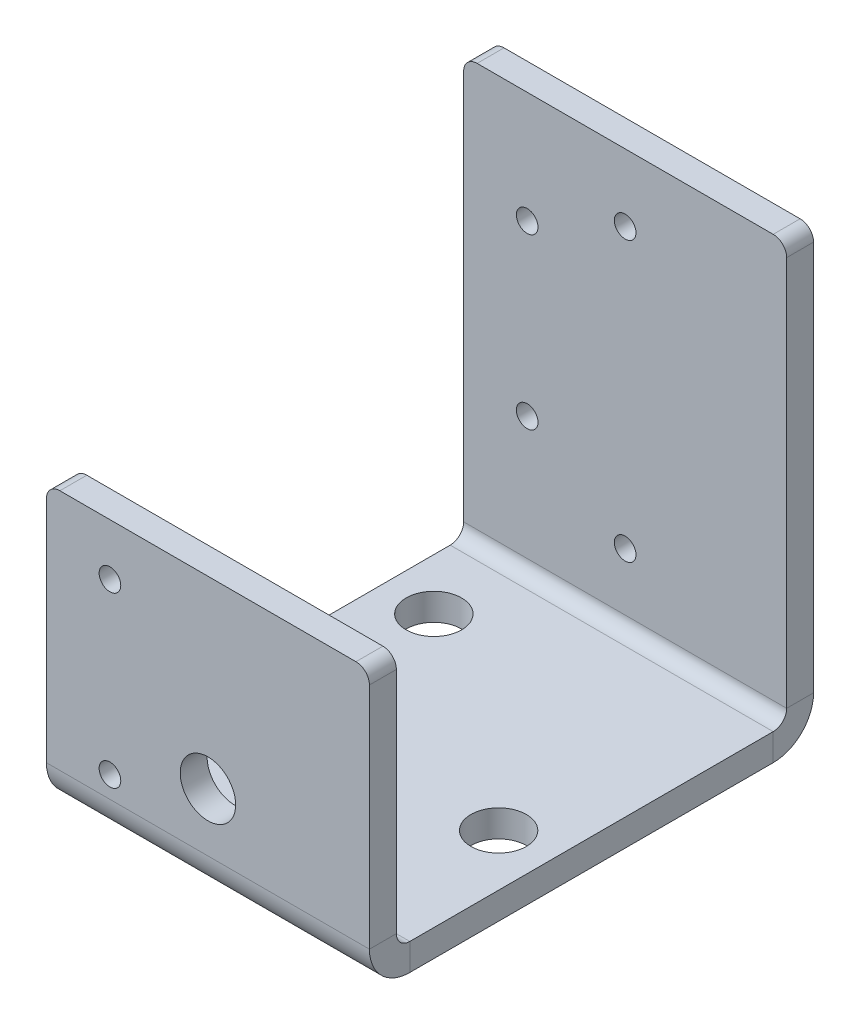
ISO-10303-21;
HEADER;
FILE_DESCRIPTION(('STEP AP214'),'2;1');
FILE_NAME('part.step','',(''),(''),'','','');
FILE_SCHEMA(('AUTOMOTIVE_DESIGN { 1 0 10303 214 1 1 1 1 }'));
ENDSEC;
DATA;
#1=APPLICATION_CONTEXT('core data for automotive mechanical design processes');
#2=APPLICATION_PROTOCOL_DEFINITION('international standard','automotive_design',2000,#1);
#3=PRODUCT_CONTEXT('',#1,'mechanical');
#4=PRODUCT('Part','Part','',(#3));
#5=PRODUCT_RELATED_PRODUCT_CATEGORY('part','',(#4));
#6=PRODUCT_DEFINITION_FORMATION('','',#4);
#7=PRODUCT_DEFINITION_CONTEXT('part definition',#1,'design');
#8=PRODUCT_DEFINITION('design','',#6,#7);
#9=PRODUCT_DEFINITION_SHAPE('','',#8);
#10=(LENGTH_UNIT() NAMED_UNIT(*) SI_UNIT(.MILLI.,.METRE.));
#11=(NAMED_UNIT(*) PLANE_ANGLE_UNIT() SI_UNIT($,.RADIAN.));
#12=(NAMED_UNIT(*) SI_UNIT($,.STERADIAN.) SOLID_ANGLE_UNIT());
#13=UNCERTAINTY_MEASURE_WITH_UNIT(LENGTH_MEASURE(1.E-05),#10,'distance_accuracy_value','');
#14=(GEOMETRIC_REPRESENTATION_CONTEXT(3) GLOBAL_UNCERTAINTY_ASSIGNED_CONTEXT((#13)) GLOBAL_UNIT_ASSIGNED_CONTEXT((#10,
#11,#12)) REPRESENTATION_CONTEXT('',''));
#15=CARTESIAN_POINT('',(0.,0.,0.));
#16=DIRECTION('',(0.,0.,1.));
#17=DIRECTION('',(1.,0.,0.));
#18=AXIS2_PLACEMENT_3D('',#15,#16,#17);
#19=CARTESIAN_POINT('',(76.2,9.52500000000001,-98.425));
#20=DIRECTION('',(1.,0.,0.));
#21=DIRECTION('',(0.,0.,-1.));
#22=AXIS2_PLACEMENT_3D('',#19,#20,#21);
#23=PLANE('',#22);
#24=DIRECTION('',(0.,0.,-1.));
#25=VECTOR('',#24,1.);
#26=CARTESIAN_POINT('',(76.2,0.,0.));
#27=LINE('',#26,#25);
#28=CARTESIAN_POINT('',(76.2,0.,-9.52499999999996));
#29=VERTEX_POINT('',#28);
#30=CARTESIAN_POINT('',(76.2,-6.66743379257317E-08,-95.25));
#31=VERTEX_POINT('',#30);
#32=EDGE_CURVE('E332',#29,#31,#27,.T.);
#33=ORIENTED_EDGE('',*,*,#32,.T.);
#34=DIRECTION('',(0.,1.,0.));
#35=VECTOR('',#34,1.);
#36=CARTESIAN_POINT('',(76.2,0.,-95.25));
#37=LINE('',#36,#35);
#38=CARTESIAN_POINT('',(76.2,6.34999996666283,-95.25));
#39=VERTEX_POINT('',#38);
#40=EDGE_CURVE('E342',#31,#39,#37,.T.);
#41=ORIENTED_EDGE('',*,*,#40,.T.);
#42=DIRECTION('',(0.,0.,-1.));
#43=VECTOR('',#42,1.);
#44=CARTESIAN_POINT('',(76.2,6.35,0.));
#45=LINE('',#44,#43);
#46=CARTESIAN_POINT('',(76.2,6.35000000333372,-9.52499999999996));
#47=VERTEX_POINT('',#46);
#48=EDGE_CURVE('E329',#47,#39,#45,.T.);
#49=ORIENTED_EDGE('',*,*,#48,.F.);
#50=DIRECTION('',(0.,-1.,0.));
#51=VECTOR('',#50,1.);
#52=CARTESIAN_POINT('',(76.2,6.35,-9.52499999999996));
#53=LINE('',#52,#51);
#54=EDGE_CURVE('E356',#47,#29,#53,.T.);
#55=ORIENTED_EDGE('',*,*,#54,.T.);
#56=EDGE_LOOP('',(#33,#41,#49,#55));
#57=FACE_BOUND('',#56,.T.);
#58=ADVANCED_FACE('F82',(#57),#23,.T.);
#59=CARTESIAN_POINT('',(0.,9.52499999999999,-6.34999999999996));
#60=DIRECTION('',(-1.,0.,0.));
#61=DIRECTION('',(0.,0.,1.));
#62=AXIS2_PLACEMENT_3D('',#59,#60,#61);
#63=PLANE('',#62);
#64=DIRECTION('',(0.,0.,-1.));
#65=VECTOR('',#64,1.);
#66=CARTESIAN_POINT('',(0.,0.,0.));
#67=LINE('',#66,#65);
#68=CARTESIAN_POINT('',(0.,6.66743396604552E-09,-9.52499999999996));
#69=VERTEX_POINT('',#68);
#70=CARTESIAN_POINT('',(0.,0.,-95.25));
#71=VERTEX_POINT('',#70);
#72=EDGE_CURVE('E326',#69,#71,#67,.T.);
#73=ORIENTED_EDGE('',*,*,#72,.F.);
#74=DIRECTION('',(0.,1.,0.));
#75=VECTOR('',#74,1.);
#76=CARTESIAN_POINT('',(0.,0.,-9.52499999999996));
#77=LINE('',#76,#75);
#78=CARTESIAN_POINT('',(0.,6.35000000666743,-9.52499999999996));
#79=VERTEX_POINT('',#78);
#80=EDGE_CURVE('E224',#69,#79,#77,.T.);
#81=ORIENTED_EDGE('',*,*,#80,.T.);
#82=DIRECTION('',(0.,0.,-1.));
#83=VECTOR('',#82,1.);
#84=CARTESIAN_POINT('',(0.,6.35,0.));
#85=LINE('',#84,#83);
#86=CARTESIAN_POINT('',(0.,6.34999996666283,-95.25));
#87=VERTEX_POINT('',#86);
#88=EDGE_CURVE('E323',#79,#87,#85,.T.);
#89=ORIENTED_EDGE('',*,*,#88,.T.);
#90=DIRECTION('',(0.,-1.,0.));
#91=VECTOR('',#90,1.);
#92=CARTESIAN_POINT('',(0.,6.35,-95.25));
#93=LINE('',#92,#91);
#94=EDGE_CURVE('E347',#87,#71,#93,.T.);
#95=ORIENTED_EDGE('',*,*,#94,.T.);
#96=EDGE_LOOP('',(#73,#81,#89,#95));
#97=FACE_BOUND('',#96,.T.);
#98=ADVANCED_FACE('F423',(#97),#63,.T.);
#99=CARTESIAN_POINT('',(76.2,6.35,0.));
#100=DIRECTION('',(0.,1.,0.));
#101=DIRECTION('',(0.,0.,1.));
#102=AXIS2_PLACEMENT_3D('',#99,#100,#101);
#103=PLANE('',#102);
#104=CARTESIAN_POINT('',(64.008,6.35,-42.672));
#105=DIRECTION('',(0.,1.,0.));
#106=DIRECTION('',(0.,0.,1.));
#107=AXIS2_PLACEMENT_3D('',#104,#105,#106);
#108=CIRCLE('',#107,6.5405);
#109=CARTESIAN_POINT('',(64.008,6.35,-36.1315));
#110=VERTEX_POINT('',#109);
#111=EDGE_CURVE('E315',#110,#110,#108,.T.);
#112=ORIENTED_EDGE('',*,*,#111,.F.);
#113=EDGE_LOOP('',(#112));
#114=FACE_BOUND('',#113,.T.);
#115=CARTESIAN_POINT('',(12.1192989557191,6.35,-79.2754520767815));
#116=DIRECTION('',(0.,1.,0.));
#117=DIRECTION('',(0.,0.,1.));
#118=AXIS2_PLACEMENT_3D('',#115,#116,#117);
#119=CIRCLE('',#118,6.5405);
#120=CARTESIAN_POINT('',(12.1192989557191,6.35,-72.7349520767815));
#121=VERTEX_POINT('',#120);
#122=EDGE_CURVE('E319',#121,#121,#119,.T.);
#123=ORIENTED_EDGE('',*,*,#122,.F.);
#124=EDGE_LOOP('',(#123));
#125=FACE_BOUND('',#124,.T.);
#126=ORIENTED_EDGE('',*,*,#88,.F.);
#127=DIRECTION('',(-1.,0.,0.));
#128=VECTOR('',#127,1.);
#129=CARTESIAN_POINT('',(76.2,6.35,-9.52499999999996));
#130=LINE('',#129,#128);
#131=EDGE_CURVE('E350',#47,#79,#130,.T.);
#132=ORIENTED_EDGE('',*,*,#131,.F.);
#133=ORIENTED_EDGE('',*,*,#48,.T.);
#134=DIRECTION('',(-1.,0.,0.));
#135=VECTOR('',#134,1.);
#136=CARTESIAN_POINT('',(76.2,6.35,-95.25));
#137=LINE('',#136,#135);
#138=EDGE_CURVE('E335',#39,#87,#137,.T.);
#139=ORIENTED_EDGE('',*,*,#138,.T.);
#140=EDGE_LOOP('',(#126,#132,#133,#139));
#141=FACE_BOUND('',#140,.T.);
#142=ADVANCED_FACE('F427',(#114,#125,#141),#103,.T.);
#143=CARTESIAN_POINT('',(76.2,0.,0.));
#144=DIRECTION('',(0.,1.,0.));
#145=DIRECTION('',(0.,0.,1.));
#146=AXIS2_PLACEMENT_3D('',#143,#144,#145);
#147=PLANE('',#146);
#148=CARTESIAN_POINT('',(64.008,0.,-42.672));
#149=DIRECTION('',(0.,1.,0.));
#150=DIRECTION('',(0.,0.,1.));
#151=AXIS2_PLACEMENT_3D('',#148,#149,#150);
#152=CIRCLE('',#151,6.5405);
#153=CARTESIAN_POINT('',(64.008,0.,-36.1315));
#154=VERTEX_POINT('',#153);
#155=EDGE_CURVE('E318',#154,#154,#152,.T.);
#156=ORIENTED_EDGE('',*,*,#155,.T.);
#157=EDGE_LOOP('',(#156));
#158=FACE_BOUND('',#157,.T.);
#159=CARTESIAN_POINT('',(12.1192989557191,0.,-79.2754520767815));
#160=DIRECTION('',(0.,1.,0.));
#161=DIRECTION('',(0.,0.,1.));
#162=AXIS2_PLACEMENT_3D('',#159,#160,#161);
#163=CIRCLE('',#162,6.5405);
#164=CARTESIAN_POINT('',(12.1192989557191,0.,-72.7349520767815));
#165=VERTEX_POINT('',#164);
#166=EDGE_CURVE('E322',#165,#165,#163,.T.);
#167=ORIENTED_EDGE('',*,*,#166,.T.);
#168=EDGE_LOOP('',(#167));
#169=FACE_BOUND('',#168,.T.);
#170=ORIENTED_EDGE('',*,*,#72,.T.);
#171=DIRECTION('',(-1.,0.,0.));
#172=VECTOR('',#171,1.);
#173=CARTESIAN_POINT('',(76.2,0.,-95.25));
#174=LINE('',#173,#172);
#175=EDGE_CURVE('E345',#31,#71,#174,.T.);
#176=ORIENTED_EDGE('',*,*,#175,.F.);
#177=ORIENTED_EDGE('',*,*,#32,.F.);
#178=DIRECTION('',(-1.,0.,0.));
#179=VECTOR('',#178,1.);
#180=CARTESIAN_POINT('',(76.2,0.,-9.52499999999996));
#181=LINE('',#180,#179);
#182=EDGE_CURVE('E353',#29,#69,#181,.T.);
#183=ORIENTED_EDGE('',*,*,#182,.T.);
#184=EDGE_LOOP('',(#170,#176,#177,#183));
#185=FACE_BOUND('',#184,.T.);
#186=ADVANCED_FACE('F439',(#158,#169,#185),#147,.F.);
#187=CARTESIAN_POINT('',(12.1192989557191,-3.81,-79.2754520767815));
#188=DIRECTION('',(0.,1.,0.));
#189=DIRECTION('',(0.,0.,1.));
#190=AXIS2_PLACEMENT_3D('',#187,#188,#189);
#191=CYLINDRICAL_SURFACE('',#190,6.5405);
#192=ORIENTED_EDGE('',*,*,#122,.T.);
#193=EDGE_LOOP('',(#192));
#194=FACE_BOUND('',#193,.T.);
#195=ORIENTED_EDGE('',*,*,#166,.F.);
#196=EDGE_LOOP('',(#195));
#197=FACE_BOUND('',#196,.T.);
#198=ADVANCED_FACE('F510',(#194,#197),#191,.F.);
#199=CARTESIAN_POINT('',(64.008,-3.81,-42.672));
#200=DIRECTION('',(0.,1.,0.));
#201=DIRECTION('',(0.,0.,1.));
#202=AXIS2_PLACEMENT_3D('',#199,#200,#201);
#203=CYLINDRICAL_SURFACE('',#202,6.5405);
#204=ORIENTED_EDGE('',*,*,#111,.T.);
#205=EDGE_LOOP('',(#204));
#206=FACE_BOUND('',#205,.T.);
#207=ORIENTED_EDGE('',*,*,#155,.F.);
#208=EDGE_LOOP('',(#207));
#209=FACE_BOUND('',#208,.T.);
#210=ADVANCED_FACE('F514',(#206,#209),#203,.F.);
#211=CARTESIAN_POINT('',(76.2,9.52500006667434,-95.25));
#212=DIRECTION('',(-1.,0.,0.));
#213=DIRECTION('',(0.,0.,1.));
#214=AXIS2_PLACEMENT_3D('',#211,#212,#213);
#215=PLANE('',#214);
#216=ORIENTED_EDGE('',*,*,#40,.F.);
#217=CARTESIAN_POINT('',(76.2,9.525,-95.25));
#218=DIRECTION('',(-1.,0.,0.));
#219=DIRECTION('',(0.,0.,1.));
#220=AXIS2_PLACEMENT_3D('',#217,#218,#219);
#221=CIRCLE('',#220,9.52500006667434);
#222=CARTESIAN_POINT('',(76.2,9.52500000000003,-104.775));
#223=VERTEX_POINT('',#222);
#224=EDGE_CURVE('E254',#31,#223,#221,.F.);
#225=ORIENTED_EDGE('',*,*,#224,.T.);
#226=DIRECTION('',(0.,0.,-1.));
#227=VECTOR('',#226,1.);
#228=CARTESIAN_POINT('',(76.2,9.52500000000001,-98.425));
#229=LINE('',#228,#227);
#230=CARTESIAN_POINT('',(76.2,9.52500000000003,-98.4249999999999));
#231=VERTEX_POINT('',#230);
#232=EDGE_CURVE('E263',#231,#223,#229,.T.);
#233=ORIENTED_EDGE('',*,*,#232,.F.);
#234=CARTESIAN_POINT('',(76.2,9.52500006667434,-95.25));
#235=DIRECTION('',(1.,0.,0.));
#236=DIRECTION('',(0.,0.,-1.));
#237=AXIS2_PLACEMENT_3D('',#234,#235,#236);
#238=CIRCLE('',#237,3.1750001000115);
#239=EDGE_CURVE('E307',#39,#231,#238,.T.);
#240=ORIENTED_EDGE('',*,*,#239,.F.);
#241=EDGE_LOOP('',(#216,#225,#233,#240));
#242=FACE_BOUND('',#241,.T.);
#243=ADVANCED_FACE('F434',(#242),#215,.F.);
#244=CARTESIAN_POINT('',(0.,9.52500006667434,-95.25));
#245=DIRECTION('',(1.,0.,0.));
#246=DIRECTION('',(0.,0.,-1.));
#247=AXIS2_PLACEMENT_3D('',#244,#245,#246);
#248=PLANE('',#247);
#249=DIRECTION('',(0.,0.,1.));
#250=VECTOR('',#249,1.);
#251=CARTESIAN_POINT('',(0.,9.52500000000003,-104.775));
#252=LINE('',#251,#250);
#253=CARTESIAN_POINT('',(0.,9.52500000000003,-104.775));
#254=VERTEX_POINT('',#253);
#255=CARTESIAN_POINT('',(0.,9.52500000000001,-98.4250000666743));
#256=VERTEX_POINT('',#255);
#257=EDGE_CURVE('E255',#254,#256,#252,.T.);
#258=ORIENTED_EDGE('',*,*,#257,.F.);
#259=CARTESIAN_POINT('',(0.,9.525,-95.25));
#260=DIRECTION('',(-1.,0.,0.));
#261=DIRECTION('',(0.,0.,1.));
#262=AXIS2_PLACEMENT_3D('',#259,#260,#261);
#263=CIRCLE('',#262,9.52500006667434);
#264=EDGE_CURVE('E304',#254,#71,#263,.T.);
#265=ORIENTED_EDGE('',*,*,#264,.T.);
#266=ORIENTED_EDGE('',*,*,#94,.F.);
#267=CARTESIAN_POINT('',(0.,9.52500006667434,-95.25));
#268=DIRECTION('',(-1.,0.,0.));
#269=DIRECTION('',(0.,0.,1.));
#270=AXIS2_PLACEMENT_3D('',#267,#268,#269);
#271=CIRCLE('',#270,3.1750001000115);
#272=EDGE_CURVE('E312',#256,#87,#271,.T.);
#273=ORIENTED_EDGE('',*,*,#272,.F.);
#274=EDGE_LOOP('',(#258,#265,#266,#273));
#275=FACE_BOUND('',#274,.T.);
#276=ADVANCED_FACE('F420',(#275),#248,.F.);
#277=CARTESIAN_POINT('',(115.211959389356,9.525,-95.25));
#278=DIRECTION('',(-1.,0.,0.));
#279=DIRECTION('',(0.,0.,1.));
#280=AXIS2_PLACEMENT_3D('',#277,#278,#279);
#281=CYLINDRICAL_SURFACE('',#280,3.17500006667434);
#282=ORIENTED_EDGE('',*,*,#272,.T.);
#283=ORIENTED_EDGE('',*,*,#138,.F.);
#284=ORIENTED_EDGE('',*,*,#239,.T.);
#285=DIRECTION('',(-1.,0.,0.));
#286=VECTOR('',#285,1.);
#287=CARTESIAN_POINT('',(76.2,9.52500000000001,-98.425));
#288=LINE('',#287,#286);
#289=EDGE_CURVE('E250',#231,#256,#288,.T.);
#290=ORIENTED_EDGE('',*,*,#289,.T.);
#291=EDGE_LOOP('',(#282,#283,#284,#290));
#292=FACE_BOUND('',#291,.T.);
#293=ADVANCED_FACE('F417',(#292),#281,.F.);
#294=CARTESIAN_POINT('',(115.211959389356,9.525,-95.25));
#295=DIRECTION('',(-1.,0.,0.));
#296=DIRECTION('',(0.,0.,1.));
#297=AXIS2_PLACEMENT_3D('',#294,#295,#296);
#298=CYLINDRICAL_SURFACE('',#297,9.52500006667434);
#299=ORIENTED_EDGE('',*,*,#264,.F.);
#300=DIRECTION('',(-1.,0.,0.));
#301=VECTOR('',#300,1.);
#302=CARTESIAN_POINT('',(76.2,9.52500000000003,-104.775));
#303=LINE('',#302,#301);
#304=EDGE_CURVE('E257',#223,#254,#303,.T.);
#305=ORIENTED_EDGE('',*,*,#304,.F.);
#306=ORIENTED_EDGE('',*,*,#224,.F.);
#307=ORIENTED_EDGE('',*,*,#175,.T.);
#308=EDGE_LOOP('',(#299,#305,#306,#307));
#309=FACE_BOUND('',#308,.T.);
#310=ADVANCED_FACE('F437',(#309),#298,.T.);
#311=CARTESIAN_POINT('',(14.986,38.608,-104.775));
#312=DIRECTION('',(0.,0.,1.));
#313=DIRECTION('',(1.,0.,0.));
#314=AXIS2_PLACEMENT_3D('',#311,#312,#313);
#315=CYLINDRICAL_SURFACE('',#314,2.5527);
#316=CARTESIAN_POINT('',(14.986,38.608,-104.775));
#317=DIRECTION('',(0.,0.,-1.));
#318=DIRECTION('',(-1.,0.,0.));
#319=AXIS2_PLACEMENT_3D('',#316,#317,#318);
#320=CIRCLE('',#319,2.5527);
#321=CARTESIAN_POINT('',(12.4333,38.608,-104.775));
#322=VERTEX_POINT('',#321);
#323=EDGE_CURVE('E299',#322,#322,#320,.T.);
#324=ORIENTED_EDGE('',*,*,#323,.T.);
#325=EDGE_LOOP('',(#324));
#326=FACE_BOUND('',#325,.T.);
#327=CARTESIAN_POINT('',(14.986,38.608,-98.425));
#328=DIRECTION('',(0.,0.,-1.));
#329=DIRECTION('',(-1.,0.,0.));
#330=AXIS2_PLACEMENT_3D('',#327,#328,#329);
#331=CIRCLE('',#330,2.5527);
#332=CARTESIAN_POINT('',(12.4333,38.608,-98.425));
#333=VERTEX_POINT('',#332);
#334=EDGE_CURVE('E269',#333,#333,#331,.T.);
#335=ORIENTED_EDGE('',*,*,#334,.F.);
#336=EDGE_LOOP('',(#335));
#337=FACE_BOUND('',#336,.T.);
#338=ADVANCED_FACE('F527',(#326,#337),#315,.F.);
#339=CARTESIAN_POINT('',(38.1,23.114,-104.775));
#340=DIRECTION('',(0.,0.,1.));
#341=DIRECTION('',(1.,0.,0.));
#342=AXIS2_PLACEMENT_3D('',#339,#340,#341);
#343=CYLINDRICAL_SURFACE('',#342,2.5527);
#344=CARTESIAN_POINT('',(38.1,23.114,-104.775));
#345=DIRECTION('',(0.,0.,-1.));
#346=DIRECTION('',(-1.,0.,0.));
#347=AXIS2_PLACEMENT_3D('',#344,#345,#346);
#348=CIRCLE('',#347,2.5527);
#349=CARTESIAN_POINT('',(35.5473,23.114,-104.775));
#350=VERTEX_POINT('',#349);
#351=EDGE_CURVE('E296',#350,#350,#348,.T.);
#352=ORIENTED_EDGE('',*,*,#351,.T.);
#353=EDGE_LOOP('',(#352));
#354=FACE_BOUND('',#353,.T.);
#355=CARTESIAN_POINT('',(38.1,23.114,-98.425));
#356=DIRECTION('',(0.,0.,-1.));
#357=DIRECTION('',(-1.,0.,0.));
#358=AXIS2_PLACEMENT_3D('',#355,#356,#357);
#359=CIRCLE('',#358,2.5527);
#360=CARTESIAN_POINT('',(35.5473,23.114,-98.425));
#361=VERTEX_POINT('',#360);
#362=EDGE_CURVE('E272',#361,#361,#359,.T.);
#363=ORIENTED_EDGE('',*,*,#362,.F.);
#364=EDGE_LOOP('',(#363));
#365=FACE_BOUND('',#364,.T.);
#366=ADVANCED_FACE('F548',(#354,#365),#343,.F.);
#367=CARTESIAN_POINT('',(76.2,104.775,-98.4249999999996));
#368=DIRECTION('',(0.,1.,0.));
#369=DIRECTION('',(0.,0.,1.));
#370=AXIS2_PLACEMENT_3D('',#367,#368,#369);
#371=PLANE('',#370);
#372=DIRECTION('',(-1.,0.,0.));
#373=VECTOR('',#372,1.);
#374=CARTESIAN_POINT('',(76.2,104.775,-104.775));
#375=LINE('',#374,#373);
#376=CARTESIAN_POINT('',(73.025,104.775,-104.775));
#377=VERTEX_POINT('',#376);
#378=CARTESIAN_POINT('',(3.17500000000003,104.775,-104.775));
#379=VERTEX_POINT('',#378);
#380=EDGE_CURVE('E293',#377,#379,#375,.T.);
#381=ORIENTED_EDGE('',*,*,#380,.T.);
#382=DIRECTION('',(0.,0.,-1.));
#383=VECTOR('',#382,1.);
#384=CARTESIAN_POINT('',(3.175,104.775,-98.4249999999996));
#385=LINE('',#384,#383);
#386=CARTESIAN_POINT('',(3.17500000000003,104.775,-98.4249999999996));
#387=VERTEX_POINT('',#386);
#388=EDGE_CURVE('E369',#379,#387,#385,.F.);
#389=ORIENTED_EDGE('',*,*,#388,.T.);
#390=DIRECTION('',(-1.,0.,0.));
#391=VECTOR('',#390,1.);
#392=CARTESIAN_POINT('',(76.2,104.775,-98.4249999999996));
#393=LINE('',#392,#391);
#394=CARTESIAN_POINT('',(73.025,104.775,-98.4249999999996));
#395=VERTEX_POINT('',#394);
#396=EDGE_CURVE('E275',#395,#387,#393,.T.);
#397=ORIENTED_EDGE('',*,*,#396,.F.);
#398=DIRECTION('',(0.,0.,-1.));
#399=VECTOR('',#398,1.);
#400=CARTESIAN_POINT('',(73.025,104.775,-98.4249999999996));
#401=LINE('',#400,#399);
#402=EDGE_CURVE('E366',#395,#377,#401,.T.);
#403=ORIENTED_EDGE('',*,*,#402,.T.);
#404=EDGE_LOOP('',(#381,#389,#397,#403));
#405=FACE_BOUND('',#404,.T.);
#406=ADVANCED_FACE('F403',(#405),#371,.T.);
#407=CARTESIAN_POINT('',(38.1,88.9,-104.775));
#408=DIRECTION('',(0.,0.,1.));
#409=DIRECTION('',(1.,0.,0.));
#410=AXIS2_PLACEMENT_3D('',#407,#408,#409);
#411=CYLINDRICAL_SURFACE('',#410,2.5527);
#412=CARTESIAN_POINT('',(38.1,88.9,-104.775));
#413=DIRECTION('',(0.,0.,-1.));
#414=DIRECTION('',(-1.,0.,0.));
#415=AXIS2_PLACEMENT_3D('',#412,#413,#414);
#416=CIRCLE('',#415,2.5527);
#417=CARTESIAN_POINT('',(35.5473,88.9,-104.775));
#418=VERTEX_POINT('',#417);
#419=EDGE_CURVE('E290',#418,#418,#416,.T.);
#420=ORIENTED_EDGE('',*,*,#419,.T.);
#421=EDGE_LOOP('',(#420));
#422=FACE_BOUND('',#421,.T.);
#423=CARTESIAN_POINT('',(38.1,88.9,-98.425));
#424=DIRECTION('',(0.,0.,-1.));
#425=DIRECTION('',(-1.,0.,0.));
#426=AXIS2_PLACEMENT_3D('',#423,#424,#425);
#427=CIRCLE('',#426,2.5527);
#428=CARTESIAN_POINT('',(35.5473,88.9,-98.425));
#429=VERTEX_POINT('',#428);
#430=EDGE_CURVE('E281',#429,#429,#427,.T.);
#431=ORIENTED_EDGE('',*,*,#430,.F.);
#432=EDGE_LOOP('',(#431));
#433=FACE_BOUND('',#432,.T.);
#434=ADVANCED_FACE('F541',(#422,#433),#411,.F.);
#435=CARTESIAN_POINT('',(14.986,78.486,-104.775));
#436=DIRECTION('',(0.,0.,1.));
#437=DIRECTION('',(1.,0.,0.));
#438=AXIS2_PLACEMENT_3D('',#435,#436,#437);
#439=CYLINDRICAL_SURFACE('',#438,2.5527);
#440=CARTESIAN_POINT('',(14.986,78.486,-104.775));
#441=DIRECTION('',(0.,0.,-1.));
#442=DIRECTION('',(-1.,0.,0.));
#443=AXIS2_PLACEMENT_3D('',#440,#441,#442);
#444=CIRCLE('',#443,2.5527);
#445=CARTESIAN_POINT('',(12.4333,78.486,-104.775));
#446=VERTEX_POINT('',#445);
#447=EDGE_CURVE('E287',#446,#446,#444,.T.);
#448=ORIENTED_EDGE('',*,*,#447,.T.);
#449=EDGE_LOOP('',(#448));
#450=FACE_BOUND('',#449,.T.);
#451=CARTESIAN_POINT('',(14.986,78.486,-98.425));
#452=DIRECTION('',(0.,0.,-1.));
#453=DIRECTION('',(-1.,0.,0.));
#454=AXIS2_PLACEMENT_3D('',#451,#452,#453);
#455=CIRCLE('',#454,2.5527);
#456=CARTESIAN_POINT('',(12.4333,78.486,-98.425));
#457=VERTEX_POINT('',#456);
#458=EDGE_CURVE('E284',#457,#457,#455,.T.);
#459=ORIENTED_EDGE('',*,*,#458,.F.);
#460=EDGE_LOOP('',(#459));
#461=FACE_BOUND('',#460,.T.);
#462=ADVANCED_FACE('F537',(#450,#461),#439,.F.);
#463=CARTESIAN_POINT('',(76.2,0.,-98.425));
#464=DIRECTION('',(0.,0.,1.));
#465=DIRECTION('',(0.,-1.,0.));
#466=AXIS2_PLACEMENT_3D('',#463,#464,#465);
#467=PLANE('',#466);
#468=ORIENTED_EDGE('',*,*,#458,.T.);
#469=EDGE_LOOP('',(#468));
#470=FACE_BOUND('',#469,.T.);
#471=ORIENTED_EDGE('',*,*,#430,.T.);
#472=EDGE_LOOP('',(#471));
#473=FACE_BOUND('',#472,.T.);
#474=ORIENTED_EDGE('',*,*,#396,.T.);
#475=CARTESIAN_POINT('',(3.175,101.6,-98.4249999999996));
#476=DIRECTION('',(0.,0.,1.));
#477=DIRECTION('',(0.,-1.,0.));
#478=AXIS2_PLACEMENT_3D('',#475,#476,#477);
#479=CIRCLE('',#478,3.175);
#480=CARTESIAN_POINT('',(0.,101.6,-98.4249999999996));
#481=VERTEX_POINT('',#480);
#482=EDGE_CURVE('E373',#387,#481,#479,.T.);
#483=ORIENTED_EDGE('',*,*,#482,.T.);
#484=DIRECTION('',(0.,1.,0.));
#485=VECTOR('',#484,1.);
#486=CARTESIAN_POINT('',(0.,0.,-98.425));
#487=LINE('',#486,#485);
#488=EDGE_CURVE('E251',#256,#481,#487,.T.);
#489=ORIENTED_EDGE('',*,*,#488,.F.);
#490=ORIENTED_EDGE('',*,*,#289,.F.);
#491=DIRECTION('',(0.,1.,0.));
#492=VECTOR('',#491,1.);
#493=CARTESIAN_POINT('',(76.2,0.,-98.425));
#494=LINE('',#493,#492);
#495=CARTESIAN_POINT('',(76.2,101.6,-98.4249999999996));
#496=VERTEX_POINT('',#495);
#497=EDGE_CURVE('E278',#231,#496,#494,.T.);
#498=ORIENTED_EDGE('',*,*,#497,.T.);
#499=CARTESIAN_POINT('',(73.025,101.6,-98.4249999999996));
#500=DIRECTION('',(0.,0.,1.));
#501=DIRECTION('',(0.,-1.,0.));
#502=AXIS2_PLACEMENT_3D('',#499,#500,#501);
#503=CIRCLE('',#502,3.175);
#504=EDGE_CURVE('E371',#496,#395,#503,.T.);
#505=ORIENTED_EDGE('',*,*,#504,.T.);
#506=EDGE_LOOP('',(#474,#483,#489,#490,#498,#505));
#507=FACE_BOUND('',#506,.T.);
#508=ORIENTED_EDGE('',*,*,#362,.T.);
#509=EDGE_LOOP('',(#508));
#510=FACE_BOUND('',#509,.T.);
#511=ORIENTED_EDGE('',*,*,#334,.T.);
#512=EDGE_LOOP('',(#511));
#513=FACE_BOUND('',#512,.T.);
#514=ADVANCED_FACE('F394',(#470,#473,#507,#510,#513),#467,.T.);
#515=CARTESIAN_POINT('',(76.2,9.52500000000001,-95.2499999999999));
#516=DIRECTION('',(1.,0.,0.));
#517=DIRECTION('',(0.,0.,-1.));
#518=AXIS2_PLACEMENT_3D('',#515,#516,#517);
#519=PLANE('',#518);
#520=DIRECTION('',(0.,1.,0.));
#521=VECTOR('',#520,1.);
#522=CARTESIAN_POINT('',(76.2,0.,-104.775));
#523=LINE('',#522,#521);
#524=CARTESIAN_POINT('',(76.2,101.6,-104.775));
#525=VERTEX_POINT('',#524);
#526=EDGE_CURVE('E266',#223,#525,#523,.T.);
#527=ORIENTED_EDGE('',*,*,#526,.T.);
#528=DIRECTION('',(0.,0.,-1.));
#529=VECTOR('',#528,1.);
#530=CARTESIAN_POINT('',(76.2,101.6,-95.2499999999995));
#531=LINE('',#530,#529);
#532=EDGE_CURVE('E89',#525,#496,#531,.F.);
#533=ORIENTED_EDGE('',*,*,#532,.T.);
#534=ORIENTED_EDGE('',*,*,#497,.F.);
#535=ORIENTED_EDGE('',*,*,#232,.T.);
#536=EDGE_LOOP('',(#527,#533,#534,#535));
#537=FACE_BOUND('',#536,.T.);
#538=ADVANCED_FACE('F389',(#537),#519,.T.);
#539=CARTESIAN_POINT('',(76.2,0.,-104.775));
#540=DIRECTION('',(0.,0.,1.));
#541=DIRECTION('',(0.,-1.,0.));
#542=AXIS2_PLACEMENT_3D('',#539,#540,#541);
#543=PLANE('',#542);
#544=ORIENTED_EDGE('',*,*,#447,.F.);
#545=EDGE_LOOP('',(#544));
#546=FACE_BOUND('',#545,.T.);
#547=ORIENTED_EDGE('',*,*,#419,.F.);
#548=EDGE_LOOP('',(#547));
#549=FACE_BOUND('',#548,.T.);
#550=DIRECTION('',(0.,1.,0.));
#551=VECTOR('',#550,1.);
#552=CARTESIAN_POINT('',(0.,0.,-104.775));
#553=LINE('',#552,#551);
#554=CARTESIAN_POINT('',(0.,101.6,-104.775));
#555=VERTEX_POINT('',#554);
#556=EDGE_CURVE('E260',#254,#555,#553,.T.);
#557=ORIENTED_EDGE('',*,*,#556,.T.);
#558=CARTESIAN_POINT('',(3.175,101.6,-104.775));
#559=DIRECTION('',(0.,0.,1.));
#560=DIRECTION('',(0.,-1.,0.));
#561=AXIS2_PLACEMENT_3D('',#558,#559,#560);
#562=CIRCLE('',#561,3.175);
#563=EDGE_CURVE('E364',#555,#379,#562,.F.);
#564=ORIENTED_EDGE('',*,*,#563,.T.);
#565=ORIENTED_EDGE('',*,*,#380,.F.);
#566=CARTESIAN_POINT('',(73.025,101.6,-104.775));
#567=DIRECTION('',(0.,0.,1.));
#568=DIRECTION('',(0.,-1.,0.));
#569=AXIS2_PLACEMENT_3D('',#566,#567,#568);
#570=CIRCLE('',#569,3.175);
#571=EDGE_CURVE('E362',#377,#525,#570,.F.);
#572=ORIENTED_EDGE('',*,*,#571,.T.);
#573=ORIENTED_EDGE('',*,*,#526,.F.);
#574=ORIENTED_EDGE('',*,*,#304,.T.);
#575=EDGE_LOOP('',(#557,#564,#565,#572,#573,#574));
#576=FACE_BOUND('',#575,.T.);
#577=ORIENTED_EDGE('',*,*,#351,.F.);
#578=EDGE_LOOP('',(#577));
#579=FACE_BOUND('',#578,.T.);
#580=ORIENTED_EDGE('',*,*,#323,.F.);
#581=EDGE_LOOP('',(#580));
#582=FACE_BOUND('',#581,.T.);
#583=ADVANCED_FACE('F406',(#546,#549,#576,#579,#582),#543,.F.);
#584=CARTESIAN_POINT('',(0.,6.34999999999999,-95.25));
#585=DIRECTION('',(-1.,0.,0.));
#586=DIRECTION('',(0.,0.,1.));
#587=AXIS2_PLACEMENT_3D('',#584,#585,#586);
#588=PLANE('',#587);
#589=ORIENTED_EDGE('',*,*,#488,.T.);
#590=DIRECTION('',(0.,0.,-1.));
#591=VECTOR('',#590,1.);
#592=CARTESIAN_POINT('',(0.,101.6,-95.2499999999995));
#593=LINE('',#592,#591);
#594=EDGE_CURVE('E359',#481,#555,#593,.T.);
#595=ORIENTED_EDGE('',*,*,#594,.T.);
#596=ORIENTED_EDGE('',*,*,#556,.F.);
#597=ORIENTED_EDGE('',*,*,#257,.T.);
#598=EDGE_LOOP('',(#589,#595,#596,#597));
#599=FACE_BOUND('',#598,.T.);
#600=ADVANCED_FACE('F413',(#599),#588,.T.);
#601=CARTESIAN_POINT('',(76.2,9.52499999333256,-9.52499999999996));
#602=DIRECTION('',(-1.,0.,0.));
#603=DIRECTION('',(0.,0.,1.));
#604=AXIS2_PLACEMENT_3D('',#601,#602,#603);
#605=PLANE('',#604);
#606=DIRECTION('',(0.,0.,-1.));
#607=VECTOR('',#606,1.);
#608=CARTESIAN_POINT('',(76.2000000004167,9.52500000666739,1.00011903309736E-08));
#609=LINE('',#608,#607);
#610=CARTESIAN_POINT('',(76.2000000004167,9.52500000666739,1.00011903309736E-08));
#611=VERTEX_POINT('',#610);
#612=CARTESIAN_POINT('',(76.2,9.52500000666742,-6.34999999999996));
#613=VERTEX_POINT('',#612);
#614=EDGE_CURVE('E245',#611,#613,#609,.T.);
#615=ORIENTED_EDGE('',*,*,#614,.F.);
#616=CARTESIAN_POINT('',(76.2,9.525,-9.52499999999996));
#617=DIRECTION('',(1.,0.,0.));
#618=DIRECTION('',(0.,0.,-1.));
#619=AXIS2_PLACEMENT_3D('',#616,#617,#618);
#620=CIRCLE('',#619,9.52499999333256);
#621=EDGE_CURVE('E229',#611,#29,#620,.T.);
#622=ORIENTED_EDGE('',*,*,#621,.T.);
#623=ORIENTED_EDGE('',*,*,#54,.F.);
#624=CARTESIAN_POINT('',(76.2,9.52499999333256,-9.52499999999996));
#625=DIRECTION('',(1.,0.,0.));
#626=DIRECTION('',(0.,0.,-1.));
#627=AXIS2_PLACEMENT_3D('',#624,#625,#626);
#628=CIRCLE('',#627,3.17499998999885);
#629=EDGE_CURVE('E228',#613,#47,#628,.T.);
#630=ORIENTED_EDGE('',*,*,#629,.F.);
#631=EDGE_LOOP('',(#615,#622,#623,#630));
#632=FACE_BOUND('',#631,.T.);
#633=ADVANCED_FACE('F442',(#632),#605,.F.);
#634=CARTESIAN_POINT('',(0.,9.52499999333256,-9.52499999999996));
#635=DIRECTION('',(1.,0.,-8.39072338497898E-11));
#636=DIRECTION('',(-8.39072338497898E-11,0.,-1.));
#637=AXIS2_PLACEMENT_3D('',#634,#635,#636);
#638=PLANE('',#637);
#639=ORIENTED_EDGE('',*,*,#80,.F.);
#640=CARTESIAN_POINT('',(0.,9.525,-9.52499999999996));
#641=DIRECTION('',(1.,0.,0.));
#642=DIRECTION('',(0.,0.,-1.));
#643=AXIS2_PLACEMENT_3D('',#640,#641,#642);
#644=CIRCLE('',#643,9.52499999333256);
#645=CARTESIAN_POINT('',(4.16714729985424E-10,9.52500000666739,1.00011903309736E-08));
#646=VERTEX_POINT('',#645);
#647=EDGE_CURVE('E221',#69,#646,#644,.F.);
#648=ORIENTED_EDGE('',*,*,#647,.T.);
#649=DIRECTION('',(0.,0.,1.));
#650=VECTOR('',#649,1.);
#651=CARTESIAN_POINT('',(4.16714729985424E-10,9.52500000666742,-6.34999998999881));
#652=LINE('',#651,#650);
#653=CARTESIAN_POINT('',(2.66419344421721E-10,9.52500000666742,-6.35000001000111));
#654=VERTEX_POINT('',#653);
#655=EDGE_CURVE('E208',#654,#646,#652,.T.);
#656=ORIENTED_EDGE('',*,*,#655,.F.);
#657=CARTESIAN_POINT('',(0.,9.52499999333256,-9.52499999999996));
#658=DIRECTION('',(-1.,0.,8.39072338497898E-11));
#659=DIRECTION('',(8.39072338497898E-11,0.,1.));
#660=AXIS2_PLACEMENT_3D('',#657,#658,#659);
#661=CIRCLE('',#660,3.17499998999885);
#662=EDGE_CURVE('E248',#79,#654,#661,.T.);
#663=ORIENTED_EDGE('',*,*,#662,.F.);
#664=EDGE_LOOP('',(#639,#648,#656,#663));
#665=FACE_BOUND('',#664,.T.);
#666=ADVANCED_FACE('F222',(#665),#638,.F.);
#667=CARTESIAN_POINT('',(-39.0119593905916,9.525,-9.52499999999996));
#668=DIRECTION('',(1.,0.,0.));
#669=DIRECTION('',(0.,0.,-1.));
#670=AXIS2_PLACEMENT_3D('',#667,#668,#669);
#671=CYLINDRICAL_SURFACE('',#670,3.17499999333257);
#672=ORIENTED_EDGE('',*,*,#662,.T.);
#673=DIRECTION('',(-1.,0.,0.));
#674=VECTOR('',#673,1.);
#675=CARTESIAN_POINT('',(76.2000000004167,9.52500000666742,-6.34999998999881));
#676=LINE('',#675,#674);
#677=EDGE_CURVE('E446',#613,#654,#676,.T.);
#678=ORIENTED_EDGE('',*,*,#677,.F.);
#679=ORIENTED_EDGE('',*,*,#629,.T.);
#680=ORIENTED_EDGE('',*,*,#131,.T.);
#681=EDGE_LOOP('',(#672,#678,#679,#680));
#682=FACE_BOUND('',#681,.T.);
#683=ADVANCED_FACE('F445',(#682),#671,.F.);
#684=CARTESIAN_POINT('',(-39.0119593905916,9.525,-9.52499999999996));
#685=DIRECTION('',(1.,0.,0.));
#686=DIRECTION('',(0.,0.,-1.));
#687=AXIS2_PLACEMENT_3D('',#684,#685,#686);
#688=CYLINDRICAL_SURFACE('',#687,9.52499999333256);
#689=ORIENTED_EDGE('',*,*,#647,.F.);
#690=ORIENTED_EDGE('',*,*,#182,.F.);
#691=ORIENTED_EDGE('',*,*,#621,.F.);
#692=DIRECTION('',(-1.,0.,0.));
#693=VECTOR('',#692,1.);
#694=CARTESIAN_POINT('',(76.2000000004167,9.52500000666739,1.00011903309736E-08));
#695=LINE('',#694,#693);
#696=EDGE_CURVE('E200',#611,#646,#695,.T.);
#697=ORIENTED_EDGE('',*,*,#696,.T.);
#698=EDGE_LOOP('',(#689,#690,#691,#697));
#699=FACE_BOUND('',#698,.T.);
#700=ADVANCED_FACE('F232',(#699),#688,.T.);
#701=CARTESIAN_POINT('',(14.9860000004167,14.6050000066674,20.8280000100011));
#702=DIRECTION('',(0.,0.,-1.));
#703=DIRECTION('',(-1.,0.,0.));
#704=AXIS2_PLACEMENT_3D('',#701,#702,#703);
#705=CYLINDRICAL_SURFACE('',#704,2.5527);
#706=CARTESIAN_POINT('',(14.9860000004167,14.6050000066674,-6.34999998999885));
#707=DIRECTION('',(0.,0.,1.));
#708=DIRECTION('',(1.,0.,0.));
#709=AXIS2_PLACEMENT_3D('',#706,#707,#708);
#710=CIRCLE('',#709,2.5527);
#711=CARTESIAN_POINT('',(17.5387000004167,14.6050000066674,-6.34999998999885));
#712=VERTEX_POINT('',#711);
#713=EDGE_CURVE('E448',#712,#712,#710,.T.);
#714=ORIENTED_EDGE('',*,*,#713,.F.);
#715=EDGE_LOOP('',(#714));
#716=FACE_BOUND('',#715,.T.);
#717=CARTESIAN_POINT('',(14.9860000004167,14.6050000066674,1.00012102528707E-08));
#718=DIRECTION('',(0.,0.,-1.));
#719=DIRECTION('',(0.,1.,0.));
#720=AXIS2_PLACEMENT_3D('',#717,#718,#719);
#721=CIRCLE('',#720,2.5527);
#722=CARTESIAN_POINT('',(14.9860000004167,17.1577000066674,1.00012197907908E-08));
#723=VERTEX_POINT('',#722);
#724=EDGE_CURVE('E233',#723,#723,#721,.F.);
#725=ORIENTED_EDGE('',*,*,#724,.T.);
#726=EDGE_LOOP('',(#725));
#727=FACE_BOUND('',#726,.T.);
#728=ADVANCED_FACE('F495',(#716,#727),#705,.F.);
#729=CARTESIAN_POINT('',(76.2000000004167,66.6750000066674,1.00014038664983E-08));
#730=DIRECTION('',(0.,1.,0.));
#731=DIRECTION('',(0.,0.,1.));
#732=AXIS2_PLACEMENT_3D('',#729,#730,#731);
#733=PLANE('',#732);
#734=DIRECTION('',(-1.,0.,0.));
#735=VECTOR('',#734,1.);
#736=CARTESIAN_POINT('',(76.2000000004167,66.6750000066674,-6.3499999899986));
#737=LINE('',#736,#735);
#738=CARTESIAN_POINT('',(73.0250000004167,66.6750000066674,-6.3499999899986));
#739=VERTEX_POINT('',#738);
#740=CARTESIAN_POINT('',(3.17500000041675,66.6750000066674,-6.3499999899986));
#741=VERTEX_POINT('',#740);
#742=EDGE_CURVE('E237',#739,#741,#737,.T.);
#743=ORIENTED_EDGE('',*,*,#742,.T.);
#744=DIRECTION('',(0.,0.,-1.));
#745=VECTOR('',#744,1.);
#746=CARTESIAN_POINT('',(3.17500000041671,66.6750000066674,1.00014024839723E-08));
#747=LINE('',#746,#745);
#748=CARTESIAN_POINT('',(3.17500000041675,66.6750000066674,1.00014038664983E-08));
#749=VERTEX_POINT('',#748);
#750=EDGE_CURVE('E102',#741,#749,#747,.F.);
#751=ORIENTED_EDGE('',*,*,#750,.T.);
#752=DIRECTION('',(-1.,0.,0.));
#753=VECTOR('',#752,1.);
#754=CARTESIAN_POINT('',(76.2000000004167,66.6750000066674,1.00014038664983E-08));
#755=LINE('',#754,#753);
#756=CARTESIAN_POINT('',(73.0250000004167,66.6750000066674,1.00014038664983E-08));
#757=VERTEX_POINT('',#756);
#758=EDGE_CURVE('E207',#757,#749,#755,.T.);
#759=ORIENTED_EDGE('',*,*,#758,.F.);
#760=DIRECTION('',(0.,0.,-1.));
#761=VECTOR('',#760,1.);
#762=CARTESIAN_POINT('',(73.0250000004167,66.6750000066674,1.00014038664983E-08));
#763=LINE('',#762,#761);
#764=EDGE_CURVE('E381',#757,#739,#763,.T.);
#765=ORIENTED_EDGE('',*,*,#764,.T.);
#766=EDGE_LOOP('',(#743,#751,#759,#765));
#767=FACE_BOUND('',#766,.T.);
#768=ADVANCED_FACE('F462',(#767),#733,.T.);
#769=CARTESIAN_POINT('',(14.9860000004167,54.4830000066674,20.8280000100011));
#770=DIRECTION('',(0.,0.,-1.));
#771=DIRECTION('',(-1.,0.,0.));
#772=AXIS2_PLACEMENT_3D('',#769,#770,#771);
#773=CYLINDRICAL_SURFACE('',#772,2.5527);
#774=CARTESIAN_POINT('',(14.9860000004167,54.4830000066674,-6.34999998999885));
#775=DIRECTION('',(0.,0.,1.));
#776=DIRECTION('',(1.,0.,0.));
#777=AXIS2_PLACEMENT_3D('',#774,#775,#776);
#778=CIRCLE('',#777,2.5527);
#779=CARTESIAN_POINT('',(17.5387000004167,54.4830000066674,-6.34999998999885));
#780=VERTEX_POINT('',#779);
#781=EDGE_CURVE('E453',#780,#780,#778,.T.);
#782=ORIENTED_EDGE('',*,*,#781,.F.);
#783=EDGE_LOOP('',(#782));
#784=FACE_BOUND('',#783,.T.);
#785=CARTESIAN_POINT('',(14.9860000004167,54.4830000066674,1.00013594390896E-08));
#786=DIRECTION('',(0.,0.,-1.));
#787=DIRECTION('',(0.,1.,0.));
#788=AXIS2_PLACEMENT_3D('',#785,#786,#787);
#789=CIRCLE('',#788,2.5527);
#790=CARTESIAN_POINT('',(14.9860000004167,57.0357000066674,1.00013689770098E-08));
#791=VERTEX_POINT('',#790);
#792=EDGE_CURVE('E459',#791,#791,#789,.F.);
#793=ORIENTED_EDGE('',*,*,#792,.T.);
#794=EDGE_LOOP('',(#793));
#795=FACE_BOUND('',#794,.T.);
#796=ADVANCED_FACE('F485',(#784,#795),#773,.F.);
#797=CARTESIAN_POINT('',(76.2000000004167,6.66745478272723E-09,-6.34999998999885));
#798=DIRECTION('',(0.,0.,-1.));
#799=DIRECTION('',(0.,1.,0.));
#800=AXIS2_PLACEMENT_3D('',#797,#798,#799);
#801=PLANE('',#800);
#802=CARTESIAN_POINT('',(38.1000000004167,23.2410000066674,-6.34999998999876));
#803=DIRECTION('',(0.,0.,-1.));
#804=DIRECTION('',(0.,1.,0.));
#805=AXIS2_PLACEMENT_3D('',#802,#803,#804);
#806=CIRCLE('',#805,6.5405);
#807=CARTESIAN_POINT('',(44.6405000004167,23.2410000066674,-6.34999998999876));
#808=VERTEX_POINT('',#807);
#809=EDGE_CURVE('E234',#808,#808,#806,.T.);
#810=ORIENTED_EDGE('',*,*,#809,.F.);
#811=EDGE_LOOP('',(#810));
#812=FACE_BOUND('',#811,.T.);
#813=ORIENTED_EDGE('',*,*,#781,.T.);
#814=EDGE_LOOP('',(#813));
#815=FACE_BOUND('',#814,.T.);
#816=DIRECTION('',(0.,-1.,0.));
#817=VECTOR('',#816,1.);
#818=CARTESIAN_POINT('',(4.16714729985424E-10,6.66745478272723E-09,-6.34999998999885));
#819=LINE('',#818,#817);
#820=CARTESIAN_POINT('',(4.16714729985424E-10,63.5000000066675,-6.34999998999861));
#821=VERTEX_POINT('',#820);
#822=EDGE_CURVE('E214',#821,#654,#819,.T.);
#823=ORIENTED_EDGE('',*,*,#822,.F.);
#824=CARTESIAN_POINT('',(3.17500000041671,63.5000000066675,-6.34999998999861));
#825=DIRECTION('',(0.,0.,-1.));
#826=DIRECTION('',(0.,1.,0.));
#827=AXIS2_PLACEMENT_3D('',#824,#825,#826);
#828=CIRCLE('',#827,3.175);
#829=EDGE_CURVE('E379',#821,#741,#828,.T.);
#830=ORIENTED_EDGE('',*,*,#829,.T.);
#831=ORIENTED_EDGE('',*,*,#742,.F.);
#832=CARTESIAN_POINT('',(73.0250000004167,63.5000000066675,-6.34999998999861));
#833=DIRECTION('',(0.,0.,-1.));
#834=DIRECTION('',(0.,1.,0.));
#835=AXIS2_PLACEMENT_3D('',#832,#833,#834);
#836=CIRCLE('',#835,3.175);
#837=CARTESIAN_POINT('',(76.2000000004167,63.5000000066675,-6.34999998999861));
#838=VERTEX_POINT('',#837);
#839=EDGE_CURVE('E377',#739,#838,#836,.T.);
#840=ORIENTED_EDGE('',*,*,#839,.T.);
#841=DIRECTION('',(0.,-1.,0.));
#842=VECTOR('',#841,1.);
#843=CARTESIAN_POINT('',(76.2000000004167,6.66745478272723E-09,-6.34999998999885));
#844=LINE('',#843,#842);
#845=EDGE_CURVE('E449',#838,#613,#844,.T.);
#846=ORIENTED_EDGE('',*,*,#845,.T.);
#847=ORIENTED_EDGE('',*,*,#677,.T.);
#848=EDGE_LOOP('',(#823,#830,#831,#840,#846,#847));
#849=FACE_BOUND('',#848,.T.);
#850=ORIENTED_EDGE('',*,*,#713,.T.);
#851=EDGE_LOOP('',(#850));
#852=FACE_BOUND('',#851,.T.);
#853=ADVANCED_FACE('F466',(#812,#815,#849,#852),#801,.T.);
#854=CARTESIAN_POINT('',(4.16714729985424E-10,9.52500000666743,-95.2499999899988));
#855=DIRECTION('',(1.,0.,0.));
#856=DIRECTION('',(0.,0.,-1.));
#857=AXIS2_PLACEMENT_3D('',#854,#855,#856);
#858=PLANE('',#857);
#859=DIRECTION('',(0.,-1.,0.));
#860=VECTOR('',#859,1.);
#861=CARTESIAN_POINT('',(4.16714729985424E-10,6.66743223132205E-09,1.00011547417195E-08));
#862=LINE('',#861,#860);
#863=CARTESIAN_POINT('',(4.16714729985424E-10,63.5000000066674,1.00013920034136E-08));
#864=VERTEX_POINT('',#863);
#865=EDGE_CURVE('E195',#864,#646,#862,.T.);
#866=ORIENTED_EDGE('',*,*,#865,.F.);
#867=DIRECTION('',(0.,0.,-1.));
#868=VECTOR('',#867,1.);
#869=CARTESIAN_POINT('',(4.16714729985424E-10,63.5000000066675,-6.34999998999861));
#870=LINE('',#869,#868);
#871=EDGE_CURVE('E375',#864,#821,#870,.T.);
#872=ORIENTED_EDGE('',*,*,#871,.T.);
#873=ORIENTED_EDGE('',*,*,#822,.T.);
#874=ORIENTED_EDGE('',*,*,#655,.T.);
#875=EDGE_LOOP('',(#866,#872,#873,#874));
#876=FACE_BOUND('',#875,.T.);
#877=ADVANCED_FACE('F212',(#876),#858,.F.);
#878=CARTESIAN_POINT('',(76.2000000004167,6.66743223132205E-09,1.00011547417195E-08));
#879=DIRECTION('',(0.,0.,-1.));
#880=DIRECTION('',(0.,1.,0.));
#881=AXIS2_PLACEMENT_3D('',#878,#879,#880);
#882=PLANE('',#881);
#883=CARTESIAN_POINT('',(38.1000000004167,23.2410000066674,0.));
#884=DIRECTION('',(0.,0.,1.));
#885=DIRECTION('',(1.,0.,0.));
#886=AXIS2_PLACEMENT_3D('',#883,#884,#885);
#887=CIRCLE('',#886,6.5405);
#888=CARTESIAN_POINT('',(44.6405000004167,23.2410000066674,0.));
#889=VERTEX_POINT('',#888);
#890=EDGE_CURVE('E240',#889,#889,#887,.T.);
#891=ORIENTED_EDGE('',*,*,#890,.F.);
#892=EDGE_LOOP('',(#891));
#893=FACE_BOUND('',#892,.T.);
#894=ORIENTED_EDGE('',*,*,#792,.F.);
#895=EDGE_LOOP('',(#894));
#896=FACE_BOUND('',#895,.T.);
#897=ORIENTED_EDGE('',*,*,#758,.T.);
#898=CARTESIAN_POINT('',(3.17500000041671,63.5000000066674,1.00013886061845E-08));
#899=DIRECTION('',(0.,0.,-1.));
#900=DIRECTION('',(0.,1.,0.));
#901=AXIS2_PLACEMENT_3D('',#898,#899,#900);
#902=CIRCLE('',#901,3.175);
#903=EDGE_CURVE('E203',#749,#864,#902,.F.);
#904=ORIENTED_EDGE('',*,*,#903,.T.);
#905=ORIENTED_EDGE('',*,*,#865,.T.);
#906=ORIENTED_EDGE('',*,*,#696,.F.);
#907=DIRECTION('',(0.,-1.,0.));
#908=VECTOR('',#907,1.);
#909=CARTESIAN_POINT('',(76.2000000004167,6.66743223132205E-09,1.00011547417195E-08));
#910=LINE('',#909,#908);
#911=CARTESIAN_POINT('',(76.2000000004167,63.5000000066674,1.00013920034136E-08));
#912=VERTEX_POINT('',#911);
#913=EDGE_CURVE('E470',#912,#611,#910,.T.);
#914=ORIENTED_EDGE('',*,*,#913,.F.);
#915=CARTESIAN_POINT('',(73.0250000004167,63.5000000066674,1.00013920034136E-08));
#916=DIRECTION('',(0.,0.,-1.));
#917=DIRECTION('',(0.,1.,0.));
#918=AXIS2_PLACEMENT_3D('',#915,#916,#917);
#919=CIRCLE('',#918,3.175);
#920=EDGE_CURVE('E385',#912,#757,#919,.F.);
#921=ORIENTED_EDGE('',*,*,#920,.T.);
#922=EDGE_LOOP('',(#897,#904,#905,#906,#914,#921));
#923=FACE_BOUND('',#922,.T.);
#924=ORIENTED_EDGE('',*,*,#724,.F.);
#925=EDGE_LOOP('',(#924));
#926=FACE_BOUND('',#925,.T.);
#927=ADVANCED_FACE('F197',(#893,#896,#923,#926),#882,.F.);
#928=CARTESIAN_POINT('',(76.2000000004167,6.35000000666743,-9.52499998999881));
#929=DIRECTION('',(1.,0.,0.));
#930=DIRECTION('',(0.,0.,-1.));
#931=AXIS2_PLACEMENT_3D('',#928,#929,#930);
#932=PLANE('',#931);
#933=ORIENTED_EDGE('',*,*,#845,.F.);
#934=DIRECTION('',(0.,0.,-1.));
#935=VECTOR('',#934,1.);
#936=CARTESIAN_POINT('',(76.2000000004167,63.5000000066675,-9.52499998999856));
#937=LINE('',#936,#935);
#938=EDGE_CURVE('E12',#838,#912,#937,.F.);
#939=ORIENTED_EDGE('',*,*,#938,.T.);
#940=ORIENTED_EDGE('',*,*,#913,.T.);
#941=ORIENTED_EDGE('',*,*,#614,.T.);
#942=EDGE_LOOP('',(#933,#939,#940,#941));
#943=FACE_BOUND('',#942,.T.);
#944=ADVANCED_FACE('F481',(#943),#932,.T.);
#945=CARTESIAN_POINT('',(38.1000000004167,23.2410000066674,-7.62));
#946=DIRECTION('',(0.,0.,1.));
#947=DIRECTION('',(1.,0.,0.));
#948=AXIS2_PLACEMENT_3D('',#945,#946,#947);
#949=CYLINDRICAL_SURFACE('',#948,6.5405);
#950=CARTESIAN_POINT('',(44.6405000004167,23.2410000066674,-6.34999998999876));
#951=CARTESIAN_POINT('',(44.6405000004167,23.2410000066674,-6.2838541567696));
#952=CARTESIAN_POINT('',(44.6405000004167,23.2410000066674,-6.21770832354045));
#953=CARTESIAN_POINT('',(44.6405000004167,23.2410000066674,-6.08541665708214));
#954=CARTESIAN_POINT('',(44.6405000004167,23.2410000066674,-6.01927082385299));
#955=CARTESIAN_POINT('',(44.6405000004167,23.2410000066674,-5.88697915739468));
#956=CARTESIAN_POINT('',(44.6405000004167,23.2410000066674,-5.82083332416553));
#957=CARTESIAN_POINT('',(44.6405000004167,23.2410000066674,-5.68854165770722));
#958=CARTESIAN_POINT('',(44.6405000004167,23.2410000066674,-5.62239582447807));
#959=CARTESIAN_POINT('',(44.6405000004167,23.2410000066674,-5.49010415801976));
#960=CARTESIAN_POINT('',(44.6405000004167,23.2410000066674,-5.42395832479061));
#961=CARTESIAN_POINT('',(44.6405000004167,23.2410000066674,-5.2916666583323));
#962=CARTESIAN_POINT('',(44.6405000004167,23.2410000066674,-5.22552082510314));
#963=CARTESIAN_POINT('',(44.6405000004167,23.2410000066674,-5.09322915864484));
#964=CARTESIAN_POINT('',(44.6405000004167,23.2410000066674,-5.02708332541568));
#965=CARTESIAN_POINT('',(44.6405000004167,23.2410000066674,-4.89479165895738));
#966=CARTESIAN_POINT('',(44.6405000004167,23.2410000066674,-4.82864582572822));
#967=CARTESIAN_POINT('',(44.6405000004167,23.2410000066674,-4.69635415926991));
#968=CARTESIAN_POINT('',(44.6405000004167,23.2410000066674,-4.63020832604076));
#969=CARTESIAN_POINT('',(44.6405000004167,23.2410000066674,-4.49791665958245));
#970=CARTESIAN_POINT('',(44.6405000004167,23.2410000066674,-4.4317708263533));
#971=CARTESIAN_POINT('',(44.6405000004167,23.2410000066674,-4.29947915989499));
#972=CARTESIAN_POINT('',(44.6405000004167,23.2410000066674,-4.23333332666584));
#973=CARTESIAN_POINT('',(44.6405000004167,23.2410000066674,-4.10104166020753));
#974=CARTESIAN_POINT('',(44.6405000004167,23.2410000066674,-4.03489582697838));
#975=CARTESIAN_POINT('',(44.6405000004167,23.2410000066674,-3.90260416052007));
#976=CARTESIAN_POINT('',(44.6405000004167,23.2410000066674,-3.83645832729092));
#977=CARTESIAN_POINT('',(44.6405000004167,23.2410000066674,-3.70416666083261));
#978=CARTESIAN_POINT('',(44.6405000004167,23.2410000066674,-3.63802082760346));
#979=CARTESIAN_POINT('',(44.6405000004167,23.2410000066674,-3.50572916114515));
#980=CARTESIAN_POINT('',(44.6405000004167,23.2410000066674,-3.43958332791599));
#981=CARTESIAN_POINT('',(44.6405000004167,23.2410000066674,-3.30729166145769));
#982=CARTESIAN_POINT('',(44.6405000004167,23.2410000066674,-3.24114582822853));
#983=CARTESIAN_POINT('',(44.6405000004167,23.2410000066674,-3.10885416177023));
#984=CARTESIAN_POINT('',(44.6405000004167,23.2410000066674,-3.04270832854107));
#985=CARTESIAN_POINT('',(44.6405000004167,23.2410000066674,-2.91041666208276));
#986=CARTESIAN_POINT('',(44.6405000004167,23.2410000066674,-2.84427082885361));
#987=CARTESIAN_POINT('',(44.6405000004167,23.2410000066674,-2.7119791623953));
#988=CARTESIAN_POINT('',(44.6405000004167,23.2410000066674,-2.64583332916615));
#989=CARTESIAN_POINT('',(44.6405000004167,23.2410000066674,-2.51354166270784));
#990=CARTESIAN_POINT('',(44.6405000004167,23.2410000066674,-2.44739582947869));
#991=CARTESIAN_POINT('',(44.6405000004167,23.2410000066674,-2.31510416302038));
#992=CARTESIAN_POINT('',(44.6405000004167,23.2410000066674,-2.24895832979123));
#993=CARTESIAN_POINT('',(44.6405000004167,23.2410000066674,-2.11666666333292));
#994=CARTESIAN_POINT('',(44.6405000004167,23.2410000066674,-2.05052083010377));
#995=CARTESIAN_POINT('',(44.6405000004167,23.2410000066674,-1.91822916364546));
#996=CARTESIAN_POINT('',(44.6405000004167,23.2410000066674,-1.8520833304163));
#997=CARTESIAN_POINT('',(44.6405000004167,23.2410000066674,-1.719791663958));
#998=CARTESIAN_POINT('',(44.6405000004167,23.2410000066674,-1.65364583072884));
#999=CARTESIAN_POINT('',(44.6405000004167,23.2410000066674,-1.52135416427054));
#1000=CARTESIAN_POINT('',(44.6405000004167,23.2410000066674,-1.45520833104138));
#1001=CARTESIAN_POINT('',(44.6405000004167,23.2410000066674,-1.32291666458307));
#1002=CARTESIAN_POINT('',(44.6405000004167,23.2410000066674,-1.25677083135392));
#1003=CARTESIAN_POINT('',(44.6405000004167,23.2410000066674,-1.12447916489561));
#1004=CARTESIAN_POINT('',(44.6405000004167,23.2410000066674,-1.05833333166646));
#1005=CARTESIAN_POINT('',(44.6405000004167,23.2410000066674,-0.926041665208152));
#1006=CARTESIAN_POINT('',(44.6405000004167,23.2410000066674,-0.859895831978998));
#1007=CARTESIAN_POINT('',(44.6405000004167,23.2410000066674,-0.727604165520691));
#1008=CARTESIAN_POINT('',(44.6405000004167,23.2410000066674,-0.661458332291538));
#1009=CARTESIAN_POINT('',(44.6405000004167,23.2410000066674,-0.52916666583323));
#1010=CARTESIAN_POINT('',(44.6405000004167,23.2410000066674,-0.463020832604076));
#1011=CARTESIAN_POINT('',(44.6405000004167,23.2410000066674,-0.330729166145769));
#1012=CARTESIAN_POINT('',(44.6405000004167,23.2410000066674,-0.264583332916615));
#1013=CARTESIAN_POINT('',(44.6405000004167,23.2410000066674,-0.132291666458307));
#1014=CARTESIAN_POINT('',(44.6405000004167,23.2410000066674,-0.0661458332291536));
#1015=CARTESIAN_POINT('',(44.6405000004167,23.2410000066674,0.));
#1016=B_SPLINE_CURVE_WITH_KNOTS('',3,(#950,#951,#952,#953,#954,#955,#956,#957,#958,#959,#960,
#961,#962,#963,#964,#965,#966,#967,#968,#969,#970,#971,#972,#973,#974,#975,#976,#977,#978,#979,
#980,#981,#982,#983,#984,#985,#986,#987,#988,#989,#990,#991,#992,#993,#994,#995,#996,#997,#998,
#999,#1000,#1001,#1002,#1003,#1004,#1005,#1006,#1007,#1008,#1009,#1010,#1011,#1012,#1013,#1014,
#1015),.UNSPECIFIED.,.F.,.F.,(4,2,2,2,2,2,2,2,2,2,2,2,2,2,2,2,2,2,2,2,2,2,2,2,2,2,2,2,2,2,2,2,
4),(0.,0.198437499687461,0.396874999374922,0.595312499062383,0.793749998749844,
0.992187498437306,1.19062499812477,1.38906249781223,1.58749999749969,1.78593749718715,
1.98437499687461,2.18281249656207,2.38124999624953,2.579687495937,2.77812499562446,
2.97656249531192,3.17499999499938,3.37343749468684,3.5718749943743,3.77031249406176,
3.96874999374922,4.16718749343668,4.36562499312415,4.56406249281161,4.76249999249907,
4.96093749218653,5.15937499187399,5.35781249156145,5.55624999124891,5.75468749093637,
5.95312499062384,6.1515624903113,6.34999998999876),.UNSPECIFIED.);
#1017=EDGE_CURVE('BSEAM477',#808,#889,#1016,.T.);
#1018=ORIENTED_EDGE('',*,*,#809,.T.);
#1019=ORIENTED_EDGE('',*,*,#890,.T.);
#1020=ORIENTED_EDGE('',*,*,#1017,.T.);
#1021=ORIENTED_EDGE('',*,*,#1017,.F.);
#1022=EDGE_LOOP('',(#1018,#1020,#1019,#1021));
#1023=FACE_BOUND('',#1022,.T.);
#1024=ADVANCED_FACE('F477',(#1023),#949,.F.);
#1025=CARTESIAN_POINT('',(3.175,101.6,-95.2499999999995));
#1026=DIRECTION('',(0.,0.,-1.));
#1027=DIRECTION('',(0.,1.,0.));
#1028=AXIS2_PLACEMENT_3D('',#1025,#1026,#1027);
#1029=CYLINDRICAL_SURFACE('',#1028,3.175);
#1030=ORIENTED_EDGE('',*,*,#482,.F.);
#1031=ORIENTED_EDGE('',*,*,#388,.F.);
#1032=ORIENTED_EDGE('',*,*,#563,.F.);
#1033=ORIENTED_EDGE('',*,*,#594,.F.);
#1034=EDGE_LOOP('',(#1030,#1031,#1032,#1033));
#1035=FACE_BOUND('',#1034,.T.);
#1036=ADVANCED_FACE('F411',(#1035),#1029,.T.);
#1037=CARTESIAN_POINT('',(3.17500000041671,63.5000000066678,-95.2499999899985));
#1038=DIRECTION('',(0.,0.,1.));
#1039=DIRECTION('',(0.,-1.,0.));
#1040=AXIS2_PLACEMENT_3D('',#1037,#1038,#1039);
#1041=CYLINDRICAL_SURFACE('',#1040,3.175);
#1042=ORIENTED_EDGE('',*,*,#903,.F.);
#1043=ORIENTED_EDGE('',*,*,#750,.F.);
#1044=ORIENTED_EDGE('',*,*,#829,.F.);
#1045=ORIENTED_EDGE('',*,*,#871,.F.);
#1046=EDGE_LOOP('',(#1042,#1043,#1044,#1045));
#1047=FACE_BOUND('',#1046,.T.);
#1048=ADVANCED_FACE('F465',(#1047),#1041,.T.);
#1049=CARTESIAN_POINT('',(73.025,101.6,-98.4249999999996));
#1050=DIRECTION('',(0.,0.,-1.));
#1051=DIRECTION('',(0.,1.,0.));
#1052=AXIS2_PLACEMENT_3D('',#1049,#1050,#1051);
#1053=CYLINDRICAL_SURFACE('',#1052,3.175);
#1054=ORIENTED_EDGE('',*,*,#504,.F.);
#1055=ORIENTED_EDGE('',*,*,#532,.F.);
#1056=ORIENTED_EDGE('',*,*,#571,.F.);
#1057=ORIENTED_EDGE('',*,*,#402,.F.);
#1058=EDGE_LOOP('',(#1054,#1055,#1056,#1057));
#1059=FACE_BOUND('',#1058,.T.);
#1060=ADVANCED_FACE('F400',(#1059),#1053,.T.);
#1061=CARTESIAN_POINT('',(73.0250000004167,63.5000000066674,1.00013899887105E-08));
#1062=DIRECTION('',(0.,0.,-1.));
#1063=DIRECTION('',(0.,1.,0.));
#1064=AXIS2_PLACEMENT_3D('',#1061,#1062,#1063);
#1065=CYLINDRICAL_SURFACE('',#1064,3.175);
#1066=ORIENTED_EDGE('',*,*,#920,.F.);
#1067=ORIENTED_EDGE('',*,*,#938,.F.);
#1068=ORIENTED_EDGE('',*,*,#839,.F.);
#1069=ORIENTED_EDGE('',*,*,#764,.F.);
#1070=EDGE_LOOP('',(#1066,#1067,#1068,#1069));
#1071=FACE_BOUND('',#1070,.T.);
#1072=ADVANCED_FACE('F604',(#1071),#1065,.T.);
#1073=CLOSED_SHELL('',(#58,#98,#142,#186,#198,#210,#243,#276,#293,#310,#338,#366,#406,#434,#462,
#514,#538,#583,#600,#633,#666,#683,#700,#728,#768,#796,#853,#877,#927,#944,#1024,#1036,#1048,
#1060,#1072));
#1074=MANIFOLD_SOLID_BREP('B2',#1073);
#1075=ADVANCED_BREP_SHAPE_REPRESENTATION('',(#18,#1074),#14);
#1076=SHAPE_DEFINITION_REPRESENTATION(#9,#1075);
ENDSEC;
END-ISO-10303-21;
